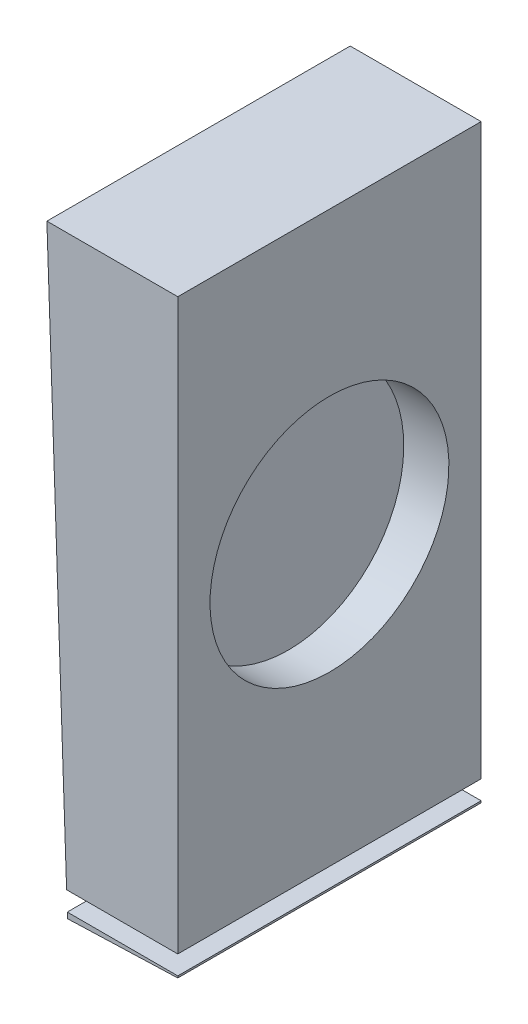
ISO-10303-21;
HEADER;
FILE_DESCRIPTION(('STEP AP214'),'2;1');
FILE_NAME('part.step','',(''),(''),'','','');
FILE_SCHEMA(('AUTOMOTIVE_DESIGN { 1 0 10303 214 1 1 1 1 }'));
ENDSEC;
DATA;
#1=APPLICATION_CONTEXT('core data for automotive mechanical design processes');
#2=APPLICATION_PROTOCOL_DEFINITION('international standard','automotive_design',2000,#1);
#3=PRODUCT_CONTEXT('',#1,'mechanical');
#4=PRODUCT('Part','Part','',(#3));
#5=PRODUCT_RELATED_PRODUCT_CATEGORY('part','',(#4));
#6=PRODUCT_DEFINITION_FORMATION('','',#4);
#7=PRODUCT_DEFINITION_CONTEXT('part definition',#1,'design');
#8=PRODUCT_DEFINITION('design','',#6,#7);
#9=PRODUCT_DEFINITION_SHAPE('','',#8);
#10=(LENGTH_UNIT() NAMED_UNIT(*) SI_UNIT(.MILLI.,.METRE.));
#11=(NAMED_UNIT(*) PLANE_ANGLE_UNIT() SI_UNIT($,.RADIAN.));
#12=(NAMED_UNIT(*) SI_UNIT($,.STERADIAN.) SOLID_ANGLE_UNIT());
#13=UNCERTAINTY_MEASURE_WITH_UNIT(LENGTH_MEASURE(1.E-05),#10,'distance_accuracy_value','');
#14=(GEOMETRIC_REPRESENTATION_CONTEXT(3) GLOBAL_UNCERTAINTY_ASSIGNED_CONTEXT((#13)) GLOBAL_UNIT_ASSIGNED_CONTEXT((#10,
#11,#12)) REPRESENTATION_CONTEXT('',''));
#15=CARTESIAN_POINT('',(0.,0.,0.));
#16=DIRECTION('',(0.,0.,1.));
#17=DIRECTION('',(1.,0.,0.));
#18=AXIS2_PLACEMENT_3D('',#15,#16,#17);
#19=CARTESIAN_POINT('',(11.6489838801098,-0.258238679913206,11.8));
#20=DIRECTION('',(0.999399830224881,0.0346407180421863,0.));
#21=DIRECTION('',(-0.0346407180421863,0.999399830224882,0.));
#22=AXIS2_PLACEMENT_3D('',#19,#20,#21);
#23=CYLINDRICAL_SURFACE('',#22,1.575);
#24=CARTESIAN_POINT('',(17.6967096592673,-0.0486153067882404,11.8));
#25=DIRECTION('',(-1.,0.,0.));
#26=DIRECTION('',(0.,1.,0.));
#27=AXIS2_PLACEMENT_3D('',#24,#25,#26);
#28=ELLIPSE('',#27,1.57594583505743,1.575);
#29=CARTESIAN_POINT('',(17.6967096592673,1.52733052826919,11.8));
#30=VERTEX_POINT('',#29);
#31=EDGE_CURVE('E116',#30,#30,#28,.T.);
#32=ORIENTED_EDGE('',*,*,#31,.F.);
#33=EDGE_LOOP('',(#32));
#34=FACE_BOUND('',#33,.T.);
#35=CARTESIAN_POINT('',(17.1004828118675,-0.0692814360843726,11.8));
#36=DIRECTION('',(0.999399830224881,0.0346407180421863,0.));
#37=DIRECTION('',(-0.0346407180421863,0.999399830224881,0.));
#38=AXIS2_PLACEMENT_3D('',#35,#36,#37);
#39=CIRCLE('',#38,1.575);
#40=CARTESIAN_POINT('',(17.045923680951,1.50477329651982,11.8));
#41=VERTEX_POINT('',#40);
#42=EDGE_CURVE('E114',#41,#41,#39,.T.);
#43=ORIENTED_EDGE('',*,*,#42,.F.);
#44=EDGE_LOOP('',(#43));
#45=FACE_BOUND('',#44,.T.);
#46=ADVANCED_FACE('F54',(#34,#45),#23,.F.);
#47=CARTESIAN_POINT('',(16.9642007614755,3.8625151813712,13.8));
#48=DIRECTION('',(0.999399830224881,0.0346407180421863,0.));
#49=DIRECTION('',(-0.0346407180421863,0.999399830224881,0.));
#50=AXIS2_PLACEMENT_3D('',#47,#48,#49);
#51=PLANE('',#50);
#52=ORIENTED_EDGE('',*,*,#42,.T.);
#53=EDGE_LOOP('',(#52));
#54=FACE_BOUND('',#53,.T.);
#55=ADVANCED_FACE('F143',(#54),#51,.T.);
#56=CARTESIAN_POINT('',(17.6967096592673,3.66364259470957,9.8));
#57=DIRECTION('',(-1.,0.,0.));
#58=DIRECTION('',(0.,0.,1.));
#59=AXIS2_PLACEMENT_3D('',#56,#57,#58);
#60=PLANE('',#59);
#61=ORIENTED_EDGE('',*,*,#31,.T.);
#62=EDGE_LOOP('',(#61));
#63=FACE_BOUND('',#62,.T.);
#64=DIRECTION('',(0.,0.,-1.));
#65=VECTOR('',#64,1.);
#66=CARTESIAN_POINT('',(17.6967096592673,-3.84250901109991,13.8));
#67=LINE('',#66,#65);
#68=CARTESIAN_POINT('',(17.6967096592673,-3.84250901109991,13.8));
#69=VERTEX_POINT('',#68);
#70=CARTESIAN_POINT('',(17.6967096592673,-3.84250901109991,9.8));
#71=VERTEX_POINT('',#70);
#72=EDGE_CURVE('E97',#69,#71,#67,.T.);
#73=ORIENTED_EDGE('',*,*,#72,.T.);
#74=DIRECTION('',(0.,-1.,0.));
#75=VECTOR('',#74,1.);
#76=CARTESIAN_POINT('',(17.6967096592673,3.66364259470957,9.8));
#77=LINE('',#76,#75);
#78=CARTESIAN_POINT('',(17.6967096592673,3.66364259470957,9.8));
#79=VERTEX_POINT('',#78);
#80=EDGE_CURVE('E71',#79,#71,#77,.T.);
#81=ORIENTED_EDGE('',*,*,#80,.F.);
#82=DIRECTION('',(0.,0.,1.));
#83=VECTOR('',#82,1.);
#84=CARTESIAN_POINT('',(17.6967096592673,3.66364259470957,9.8));
#85=LINE('',#84,#83);
#86=CARTESIAN_POINT('',(17.6967096592673,3.66364259470957,13.8));
#87=VERTEX_POINT('',#86);
#88=EDGE_CURVE('E101',#79,#87,#85,.T.);
#89=ORIENTED_EDGE('',*,*,#88,.T.);
#90=DIRECTION('',(0.,-1.,0.));
#91=VECTOR('',#90,1.);
#92=CARTESIAN_POINT('',(17.6967096592673,3.66364259470957,13.8));
#93=LINE('',#92,#91);
#94=EDGE_CURVE('E103',#87,#69,#93,.T.);
#95=ORIENTED_EDGE('',*,*,#94,.T.);
#96=EDGE_LOOP('',(#73,#81,#89,#95));
#97=FACE_BOUND('',#96,.T.);
#98=ADVANCED_FACE('F102',(#63,#97),#60,.F.);
#99=CARTESIAN_POINT('',(15.9648009312506,3.82787446332901,13.8));
#100=DIRECTION('',(0.999399830224881,0.0346407180421863,0.));
#101=DIRECTION('',(-0.0346407180421863,0.999399830224881,0.));
#102=AXIS2_PLACEMENT_3D('',#99,#100,#101);
#103=PLANE('',#102);
#104=DIRECTION('',(0.,0.,1.));
#105=VECTOR('',#104,1.);
#106=CARTESIAN_POINT('',(15.9704934575872,3.66364259470957,13.8));
#107=LINE('',#106,#105);
#108=CARTESIAN_POINT('',(15.9704934575872,3.66364259470957,9.8));
#109=VERTEX_POINT('',#108);
#110=CARTESIAN_POINT('',(15.9704934575872,3.66364259470957,13.8));
#111=VERTEX_POINT('',#110);
#112=EDGE_CURVE('E12',#109,#111,#107,.T.);
#113=ORIENTED_EDGE('',*,*,#112,.F.);
#114=DIRECTION('',(0.0346407180421863,-0.999399830224881,0.));
#115=VECTOR('',#114,1.);
#116=CARTESIAN_POINT('',(15.9648009312506,3.82787446332901,9.8));
#117=LINE('',#116,#115);
#118=CARTESIAN_POINT('',(16.2306680878953,-3.84250901109991,9.8));
#119=VERTEX_POINT('',#118);
#120=EDGE_CURVE('E58',#109,#119,#117,.T.);
#121=ORIENTED_EDGE('',*,*,#120,.T.);
#122=DIRECTION('',(0.,0.,-1.));
#123=VECTOR('',#122,1.);
#124=CARTESIAN_POINT('',(16.2306680878953,-3.84250901109991,13.8));
#125=LINE('',#124,#123);
#126=CARTESIAN_POINT('',(16.2306680878953,-3.84250901109991,13.8));
#127=VERTEX_POINT('',#126);
#128=EDGE_CURVE('E119',#127,#119,#125,.T.);
#129=ORIENTED_EDGE('',*,*,#128,.F.);
#130=DIRECTION('',(0.0346407180421863,-0.999399830224881,0.));
#131=VECTOR('',#130,1.);
#132=CARTESIAN_POINT('',(15.9648009312506,3.82787446332901,13.8));
#133=LINE('',#132,#131);
#134=EDGE_CURVE('E112',#111,#127,#133,.T.);
#135=ORIENTED_EDGE('',*,*,#134,.F.);
#136=EDGE_LOOP('',(#113,#121,#129,#135));
#137=FACE_BOUND('',#136,.T.);
#138=ADVANCED_FACE('F56',(#137),#103,.F.);
#139=CARTESIAN_POINT('',(18.85,-3.84250901109991,13.8));
#140=DIRECTION('',(0.,-1.,0.));
#141=DIRECTION('',(0.,0.,-1.));
#142=AXIS2_PLACEMENT_3D('',#139,#140,#141);
#143=PLANE('',#142);
#144=ORIENTED_EDGE('',*,*,#72,.F.);
#145=DIRECTION('',(-1.,0.,0.));
#146=VECTOR('',#145,1.);
#147=CARTESIAN_POINT('',(18.85,-3.84250901109991,13.8));
#148=LINE('',#147,#146);
#149=EDGE_CURVE('E92',#69,#127,#148,.T.);
#150=ORIENTED_EDGE('',*,*,#149,.T.);
#151=ORIENTED_EDGE('',*,*,#128,.T.);
#152=DIRECTION('',(1.,0.,0.));
#153=VECTOR('',#152,1.);
#154=CARTESIAN_POINT('',(0.,-3.84250901109991,9.8));
#155=LINE('',#154,#153);
#156=EDGE_CURVE('E120',#119,#71,#155,.T.);
#157=ORIENTED_EDGE('',*,*,#156,.T.);
#158=EDGE_LOOP('',(#144,#150,#151,#157));
#159=FACE_BOUND('',#158,.T.);
#160=ADVANCED_FACE('F134',(#159),#143,.T.);
#161=CARTESIAN_POINT('',(18.85,3.66364259470957,13.8));
#162=DIRECTION('',(0.,1.,0.));
#163=DIRECTION('',(0.,0.,1.));
#164=AXIS2_PLACEMENT_3D('',#161,#162,#163);
#165=PLANE('',#164);
#166=ORIENTED_EDGE('',*,*,#88,.F.);
#167=DIRECTION('',(-1.,0.,0.));
#168=VECTOR('',#167,1.);
#169=CARTESIAN_POINT('',(0.,3.66364259470957,9.8));
#170=LINE('',#169,#168);
#171=EDGE_CURVE('E63',#79,#109,#170,.T.);
#172=ORIENTED_EDGE('',*,*,#171,.T.);
#173=ORIENTED_EDGE('',*,*,#112,.T.);
#174=DIRECTION('',(-1.,0.,0.));
#175=VECTOR('',#174,1.);
#176=CARTESIAN_POINT('',(18.85,3.66364259470957,13.8));
#177=LINE('',#176,#175);
#178=EDGE_CURVE('E80',#87,#111,#177,.T.);
#179=ORIENTED_EDGE('',*,*,#178,.F.);
#180=EDGE_LOOP('',(#166,#172,#173,#179));
#181=FACE_BOUND('',#180,.T.);
#182=ADVANCED_FACE('F109',(#181),#165,.T.);
#183=CARTESIAN_POINT('',(0.,0.,9.8));
#184=DIRECTION('',(0.,0.,1.));
#185=DIRECTION('',(1.,0.,0.));
#186=AXIS2_PLACEMENT_3D('',#183,#184,#185);
#187=PLANE('',#186);
#188=ORIENTED_EDGE('',*,*,#171,.F.);
#189=ORIENTED_EDGE('',*,*,#80,.T.);
#190=ORIENTED_EDGE('',*,*,#156,.F.);
#191=ORIENTED_EDGE('',*,*,#120,.F.);
#192=EDGE_LOOP('',(#188,#189,#190,#191));
#193=FACE_BOUND('',#192,.T.);
#194=ADVANCED_FACE('F132',(#193),#187,.F.);
#195=CARTESIAN_POINT('',(0.,0.,13.8));
#196=DIRECTION('',(0.,0.,1.));
#197=DIRECTION('',(1.,0.,0.));
#198=AXIS2_PLACEMENT_3D('',#195,#196,#197);
#199=PLANE('',#198);
#200=ORIENTED_EDGE('',*,*,#94,.F.);
#201=ORIENTED_EDGE('',*,*,#178,.T.);
#202=ORIENTED_EDGE('',*,*,#134,.T.);
#203=ORIENTED_EDGE('',*,*,#149,.F.);
#204=EDGE_LOOP('',(#200,#201,#202,#203));
#205=FACE_BOUND('',#204,.T.);
#206=ADVANCED_FACE('F107',(#205),#199,.T.);
#207=CLOSED_SHELL('',(#46,#55,#98,#138,#160,#182,#194,#206));
#208=MANIFOLD_SOLID_BREP('B2',#207);
#209=CARTESIAN_POINT('',(0.,0.,13.8));
#210=DIRECTION('',(0.,0.,1.));
#211=DIRECTION('',(1.,0.,0.));
#212=AXIS2_PLACEMENT_3D('',#209,#210,#211);
#213=PLANE('',#212);
#214=DIRECTION('',(0.,-1.,0.));
#215=VECTOR('',#214,1.);
#216=CARTESIAN_POINT('',(17.6967096592673,3.66364259470957,13.8));
#217=LINE('',#216,#215);
#218=CARTESIAN_POINT('',(17.6967096592673,-4.09250901109991,13.8));
#219=VERTEX_POINT('',#218);
#220=CARTESIAN_POINT('',(17.6967096592673,-4.1168991877645,13.8));
#221=VERTEX_POINT('',#220);
#222=EDGE_CURVE('E249',#219,#221,#217,.T.);
#223=ORIENTED_EDGE('',*,*,#222,.F.);
#224=DIRECTION('',(-1.,0.,0.));
#225=VECTOR('',#224,1.);
#226=CARTESIAN_POINT('',(18.85,-4.09250901109991,13.8));
#227=LINE('',#226,#225);
#228=CARTESIAN_POINT('',(16.2393334681052,-4.09250901109991,13.8));
#229=VERTEX_POINT('',#228);
#230=EDGE_CURVE('E254',#219,#229,#227,.T.);
#231=ORIENTED_EDGE('',*,*,#230,.T.);
#232=DIRECTION('',(0.0346407180421863,-0.999399830224881,0.));
#233=VECTOR('',#232,1.);
#234=CARTESIAN_POINT('',(15.9648009312506,3.82787446332901,13.8));
#235=LINE('',#234,#233);
#236=CARTESIAN_POINT('',(16.2419266755881,-4.16732417847004,13.8));
#237=VERTEX_POINT('',#236);
#238=EDGE_CURVE('E232',#229,#237,#235,.T.);
#239=ORIENTED_EDGE('',*,*,#238,.T.);
#240=DIRECTION('',(0.999399830224881,0.0346407180421866,0.));
#241=VECTOR('',#240,1.);
#242=CARTESIAN_POINT('',(16.2419266755881,-4.16732417847004,13.8));
#243=LINE('',#242,#241);
#244=EDGE_CURVE('E257',#237,#221,#243,.T.);
#245=ORIENTED_EDGE('',*,*,#244,.T.);
#246=EDGE_LOOP('',(#223,#231,#239,#245));
#247=FACE_BOUND('',#246,.T.);
#248=ADVANCED_FACE('F209',(#247),#213,.T.);
#249=CARTESIAN_POINT('',(0.,0.,9.8));
#250=DIRECTION('',(0.,0.,1.));
#251=DIRECTION('',(1.,0.,0.));
#252=AXIS2_PLACEMENT_3D('',#249,#250,#251);
#253=PLANE('',#252);
#254=DIRECTION('',(-1.,0.,0.));
#255=VECTOR('',#254,1.);
#256=CARTESIAN_POINT('',(0.,-4.09250901109991,9.8));
#257=LINE('',#256,#255);
#258=CARTESIAN_POINT('',(17.6967096592673,-4.09250901109991,9.8));
#259=VERTEX_POINT('',#258);
#260=CARTESIAN_POINT('',(16.2393334681052,-4.09250901109991,9.8));
#261=VERTEX_POINT('',#260);
#262=EDGE_CURVE('E217',#259,#261,#257,.T.);
#263=ORIENTED_EDGE('',*,*,#262,.F.);
#264=DIRECTION('',(0.,-1.,0.));
#265=VECTOR('',#264,1.);
#266=CARTESIAN_POINT('',(17.6967096592673,3.66364259470957,9.8));
#267=LINE('',#266,#265);
#268=CARTESIAN_POINT('',(17.6967096592673,-4.1168991877645,9.8));
#269=VERTEX_POINT('',#268);
#270=EDGE_CURVE('E223',#259,#269,#267,.T.);
#271=ORIENTED_EDGE('',*,*,#270,.T.);
#272=DIRECTION('',(0.999399830224881,0.0346407180421866,0.));
#273=VECTOR('',#272,1.);
#274=CARTESIAN_POINT('',(16.2419266755881,-4.16732417847004,9.8));
#275=LINE('',#274,#273);
#276=CARTESIAN_POINT('',(16.2419266755881,-4.16732417847004,9.8));
#277=VERTEX_POINT('',#276);
#278=EDGE_CURVE('E269',#277,#269,#275,.T.);
#279=ORIENTED_EDGE('',*,*,#278,.F.);
#280=DIRECTION('',(0.0346407180421863,-0.999399830224881,0.));
#281=VECTOR('',#280,1.);
#282=CARTESIAN_POINT('',(15.9648009312506,3.82787446332901,9.8));
#283=LINE('',#282,#281);
#284=EDGE_CURVE('E264',#261,#277,#283,.T.);
#285=ORIENTED_EDGE('',*,*,#284,.F.);
#286=EDGE_LOOP('',(#263,#271,#279,#285));
#287=FACE_BOUND('',#286,.T.);
#288=ADVANCED_FACE('F280',(#287),#253,.F.);
#289=CARTESIAN_POINT('',(16.2419266755881,-4.16732417847004,13.8));
#290=DIRECTION('',(-0.0346407180421866,0.999399830224881,0.));
#291=DIRECTION('',(-0.999399830224881,-0.0346407180421866,0.));
#292=AXIS2_PLACEMENT_3D('',#289,#290,#291);
#293=PLANE('',#292);
#294=ORIENTED_EDGE('',*,*,#278,.T.);
#295=DIRECTION('',(0.,0.,1.));
#296=VECTOR('',#295,1.);
#297=CARTESIAN_POINT('',(17.6967096592673,-4.1168991877645,13.8));
#298=LINE('',#297,#296);
#299=EDGE_CURVE('E262',#269,#221,#298,.T.);
#300=ORIENTED_EDGE('',*,*,#299,.T.);
#301=ORIENTED_EDGE('',*,*,#244,.F.);
#302=DIRECTION('',(0.,0.,-1.));
#303=VECTOR('',#302,1.);
#304=CARTESIAN_POINT('',(16.2419266755881,-4.16732417847004,13.8));
#305=LINE('',#304,#303);
#306=EDGE_CURVE('E271',#237,#277,#305,.T.);
#307=ORIENTED_EDGE('',*,*,#306,.T.);
#308=EDGE_LOOP('',(#294,#300,#301,#307));
#309=FACE_BOUND('',#308,.T.);
#310=ADVANCED_FACE('F282',(#309),#293,.F.);
#311=CARTESIAN_POINT('',(15.9648009312506,3.82787446332901,13.8));
#312=DIRECTION('',(0.999399830224881,0.0346407180421863,0.));
#313=DIRECTION('',(-0.0346407180421863,0.999399830224881,0.));
#314=AXIS2_PLACEMENT_3D('',#311,#312,#313);
#315=PLANE('',#314);
#316=DIRECTION('',(0.,0.,1.));
#317=VECTOR('',#316,1.);
#318=CARTESIAN_POINT('',(16.2393334681052,-4.09250901109991,13.8));
#319=LINE('',#318,#317);
#320=EDGE_CURVE('E261',#261,#229,#319,.T.);
#321=ORIENTED_EDGE('',*,*,#320,.F.);
#322=ORIENTED_EDGE('',*,*,#284,.T.);
#323=ORIENTED_EDGE('',*,*,#306,.F.);
#324=ORIENTED_EDGE('',*,*,#238,.F.);
#325=EDGE_LOOP('',(#321,#322,#323,#324));
#326=FACE_BOUND('',#325,.T.);
#327=ADVANCED_FACE('F211',(#326),#315,.F.);
#328=CARTESIAN_POINT('',(18.85,-4.09250901109991,13.8));
#329=DIRECTION('',(0.,1.,0.));
#330=DIRECTION('',(0.,0.,1.));
#331=AXIS2_PLACEMENT_3D('',#328,#329,#330);
#332=PLANE('',#331);
#333=DIRECTION('',(0.,0.,1.));
#334=VECTOR('',#333,1.);
#335=CARTESIAN_POINT('',(17.6967096592673,-4.09250901109991,13.8));
#336=LINE('',#335,#334);
#337=EDGE_CURVE('E52',#259,#219,#336,.T.);
#338=ORIENTED_EDGE('',*,*,#337,.F.);
#339=ORIENTED_EDGE('',*,*,#262,.T.);
#340=ORIENTED_EDGE('',*,*,#320,.T.);
#341=ORIENTED_EDGE('',*,*,#230,.F.);
#342=EDGE_LOOP('',(#338,#339,#340,#341));
#343=FACE_BOUND('',#342,.T.);
#344=ADVANCED_FACE('F259',(#343),#332,.T.);
#345=CARTESIAN_POINT('',(17.6967096592673,3.66364259470957,9.8));
#346=DIRECTION('',(-1.,0.,0.));
#347=DIRECTION('',(0.,0.,1.));
#348=AXIS2_PLACEMENT_3D('',#345,#346,#347);
#349=PLANE('',#348);
#350=ORIENTED_EDGE('',*,*,#270,.F.);
#351=ORIENTED_EDGE('',*,*,#337,.T.);
#352=ORIENTED_EDGE('',*,*,#222,.T.);
#353=ORIENTED_EDGE('',*,*,#299,.F.);
#354=EDGE_LOOP('',(#350,#351,#352,#353));
#355=FACE_BOUND('',#354,.T.);
#356=ADVANCED_FACE('F248',(#355),#349,.F.);
#357=CLOSED_SHELL('',(#248,#288,#310,#327,#344,#356));
#358=MANIFOLD_SOLID_BREP('B6',#357);
#359=ADVANCED_BREP_SHAPE_REPRESENTATION('',(#18,#208,#358),#14);
#360=SHAPE_DEFINITION_REPRESENTATION(#9,#359);
ENDSEC;
END-ISO-10303-21;
